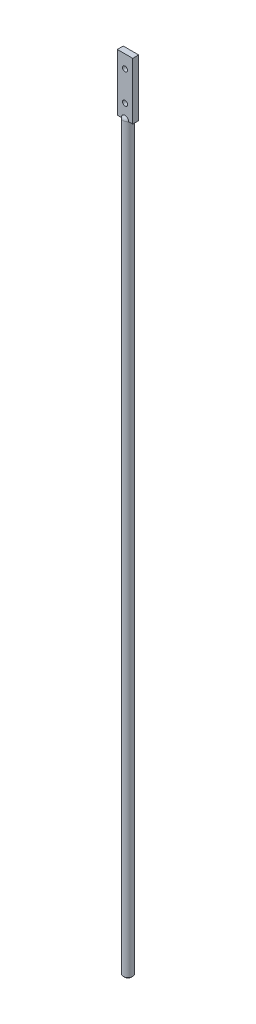
ISO-10303-21;
HEADER;
FILE_DESCRIPTION(('STEP AP214'),'2;1');
FILE_NAME('part.step','',(''),(''),'','','');
FILE_SCHEMA(('AUTOMOTIVE_DESIGN { 1 0 10303 214 1 1 1 1 }'));
ENDSEC;
DATA;
#1=APPLICATION_CONTEXT('core data for automotive mechanical design processes');
#2=APPLICATION_PROTOCOL_DEFINITION('international standard','automotive_design',2000,#1);
#3=PRODUCT_CONTEXT('',#1,'mechanical');
#4=PRODUCT('Part','Part','',(#3));
#5=PRODUCT_RELATED_PRODUCT_CATEGORY('part','',(#4));
#6=PRODUCT_DEFINITION_FORMATION('','',#4);
#7=PRODUCT_DEFINITION_CONTEXT('part definition',#1,'design');
#8=PRODUCT_DEFINITION('design','',#6,#7);
#9=PRODUCT_DEFINITION_SHAPE('','',#8);
#10=(LENGTH_UNIT() NAMED_UNIT(*) SI_UNIT(.MILLI.,.METRE.));
#11=(NAMED_UNIT(*) PLANE_ANGLE_UNIT() SI_UNIT($,.RADIAN.));
#12=(NAMED_UNIT(*) SI_UNIT($,.STERADIAN.) SOLID_ANGLE_UNIT());
#13=UNCERTAINTY_MEASURE_WITH_UNIT(LENGTH_MEASURE(1.E-05),#10,'distance_accuracy_value','');
#14=(GEOMETRIC_REPRESENTATION_CONTEXT(3) GLOBAL_UNCERTAINTY_ASSIGNED_CONTEXT((#13)) GLOBAL_UNIT_ASSIGNED_CONTEXT((#10,
#11,#12)) REPRESENTATION_CONTEXT('',''));
#15=CARTESIAN_POINT('',(0.,0.,0.));
#16=DIRECTION('',(0.,0.,1.));
#17=DIRECTION('',(1.,0.,0.));
#18=AXIS2_PLACEMENT_3D('',#15,#16,#17);
#19=CARTESIAN_POINT('',(0.,13.,-2.5));
#20=DIRECTION('',(0.,0.,-1.));
#21=DIRECTION('',(1.,0.,0.));
#22=AXIS2_PLACEMENT_3D('',#19,#20,#21);
#23=CYLINDRICAL_SURFACE('',#22,2.1);
#24=CARTESIAN_POINT('',(0.,13.,2.5));
#25=DIRECTION('',(0.,0.,1.));
#26=DIRECTION('',(1.,0.,0.));
#27=AXIS2_PLACEMENT_3D('',#24,#25,#26);
#28=CIRCLE('',#27,2.1);
#29=CARTESIAN_POINT('',(2.1,13.,2.5));
#30=VERTEX_POINT('',#29);
#31=EDGE_CURVE('E44',#30,#30,#28,.F.);
#32=ORIENTED_EDGE('',*,*,#31,.F.);
#33=EDGE_LOOP('',(#32));
#34=FACE_BOUND('',#33,.T.);
#35=CARTESIAN_POINT('',(0.,13.,-2.5));
#36=DIRECTION('',(0.,0.,1.));
#37=DIRECTION('',(1.,0.,0.));
#38=AXIS2_PLACEMENT_3D('',#35,#36,#37);
#39=CIRCLE('',#38,2.1);
#40=CARTESIAN_POINT('',(2.1,13.,-2.5));
#41=VERTEX_POINT('',#40);
#42=EDGE_CURVE('E165',#41,#41,#39,.F.);
#43=ORIENTED_EDGE('',*,*,#42,.T.);
#44=EDGE_LOOP('',(#43));
#45=FACE_BOUND('',#44,.T.);
#46=ADVANCED_FACE('F40',(#34,#45),#23,.F.);
#47=CARTESIAN_POINT('',(0.,-12.,-2.5));
#48=DIRECTION('',(0.,0.,-1.));
#49=DIRECTION('',(1.,0.,0.));
#50=AXIS2_PLACEMENT_3D('',#47,#48,#49);
#51=CYLINDRICAL_SURFACE('',#50,2.1);
#52=CARTESIAN_POINT('',(0.,-12.,2.5));
#53=DIRECTION('',(0.,0.,1.));
#54=DIRECTION('',(1.,0.,0.));
#55=AXIS2_PLACEMENT_3D('',#52,#53,#54);
#56=CIRCLE('',#55,2.1);
#57=CARTESIAN_POINT('',(2.1,-12.,2.5));
#58=VERTEX_POINT('',#57);
#59=EDGE_CURVE('E167',#58,#58,#56,.F.);
#60=ORIENTED_EDGE('',*,*,#59,.F.);
#61=EDGE_LOOP('',(#60));
#62=FACE_BOUND('',#61,.T.);
#63=CARTESIAN_POINT('',(0.,-12.,-2.5));
#64=DIRECTION('',(0.,0.,1.));
#65=DIRECTION('',(1.,0.,0.));
#66=AXIS2_PLACEMENT_3D('',#63,#64,#65);
#67=CIRCLE('',#66,2.1);
#68=CARTESIAN_POINT('',(2.1,-12.,-2.5));
#69=VERTEX_POINT('',#68);
#70=EDGE_CURVE('E137',#69,#69,#67,.F.);
#71=ORIENTED_EDGE('',*,*,#70,.T.);
#72=EDGE_LOOP('',(#71));
#73=FACE_BOUND('',#72,.T.);
#74=ADVANCED_FACE('F177',(#62,#73),#51,.F.);
#75=CARTESIAN_POINT('',(-6.50000000000001,24.,-2.5));
#76=DIRECTION('',(0.,1.,0.));
#77=DIRECTION('',(0.,0.,-1.));
#78=AXIS2_PLACEMENT_3D('',#75,#76,#77);
#79=PLANE('',#78);
#80=DIRECTION('',(1.,0.,0.));
#81=VECTOR('',#80,1.);
#82=CARTESIAN_POINT('',(0.,24.,2.5));
#83=LINE('',#82,#81);
#84=CARTESIAN_POINT('',(6.5,24.,2.5));
#85=VERTEX_POINT('',#84);
#86=CARTESIAN_POINT('',(-6.50000000000001,24.,2.5));
#87=VERTEX_POINT('',#86);
#88=EDGE_CURVE('E120',#85,#87,#83,.F.);
#89=ORIENTED_EDGE('',*,*,#88,.F.);
#90=DIRECTION('',(0.,0.,-1.));
#91=VECTOR('',#90,1.);
#92=CARTESIAN_POINT('',(6.5,24.,-2.5));
#93=LINE('',#92,#91);
#94=CARTESIAN_POINT('',(6.5,24.,-2.5));
#95=VERTEX_POINT('',#94);
#96=EDGE_CURVE('E121',#85,#95,#93,.T.);
#97=ORIENTED_EDGE('',*,*,#96,.T.);
#98=DIRECTION('',(1.,0.,0.));
#99=VECTOR('',#98,1.);
#100=CARTESIAN_POINT('',(0.,24.,-2.5));
#101=LINE('',#100,#99);
#102=CARTESIAN_POINT('',(-6.50000000000001,24.,-2.5));
#103=VERTEX_POINT('',#102);
#104=EDGE_CURVE('E105',#95,#103,#101,.F.);
#105=ORIENTED_EDGE('',*,*,#104,.T.);
#106=DIRECTION('',(0.,0.,-1.));
#107=VECTOR('',#106,1.);
#108=CARTESIAN_POINT('',(-6.50000000000001,24.,-2.5));
#109=LINE('',#108,#107);
#110=EDGE_CURVE('E147',#87,#103,#109,.T.);
#111=ORIENTED_EDGE('',*,*,#110,.F.);
#112=EDGE_LOOP('',(#89,#97,#105,#111));
#113=FACE_BOUND('',#112,.T.);
#114=ADVANCED_FACE('F207',(#113),#79,.T.);
#115=CARTESIAN_POINT('',(-6.50000000000001,24.,-2.5));
#116=DIRECTION('',(1.,0.,0.));
#117=DIRECTION('',(0.,1.,0.));
#118=AXIS2_PLACEMENT_3D('',#115,#116,#117);
#119=PLANE('',#118);
#120=DIRECTION('',(0.,1.,0.));
#121=VECTOR('',#120,1.);
#122=CARTESIAN_POINT('',(-6.50000000000001,0.,-2.5));
#123=LINE('',#122,#121);
#124=CARTESIAN_POINT('',(-6.5,-24.,-2.5));
#125=VERTEX_POINT('',#124);
#126=EDGE_CURVE('E132',#103,#125,#123,.F.);
#127=ORIENTED_EDGE('',*,*,#126,.T.);
#128=DIRECTION('',(0.,0.,-1.));
#129=VECTOR('',#128,1.);
#130=CARTESIAN_POINT('',(-6.5,-24.,-2.5));
#131=LINE('',#130,#129);
#132=CARTESIAN_POINT('',(-6.5,-24.,2.5));
#133=VERTEX_POINT('',#132);
#134=EDGE_CURVE('E104',#133,#125,#131,.T.);
#135=ORIENTED_EDGE('',*,*,#134,.F.);
#136=DIRECTION('',(0.,1.,0.));
#137=VECTOR('',#136,1.);
#138=CARTESIAN_POINT('',(-6.50000000000001,0.,2.5));
#139=LINE('',#138,#137);
#140=EDGE_CURVE('E102',#87,#133,#139,.F.);
#141=ORIENTED_EDGE('',*,*,#140,.F.);
#142=ORIENTED_EDGE('',*,*,#110,.T.);
#143=EDGE_LOOP('',(#127,#135,#141,#142));
#144=FACE_BOUND('',#143,.T.);
#145=ADVANCED_FACE('F203',(#144),#119,.F.);
#146=CARTESIAN_POINT('',(0.,-649.5,0.));
#147=DIRECTION('',(0.,-1.,0.));
#148=DIRECTION('',(0.,0.,1.));
#149=AXIS2_PLACEMENT_3D('',#146,#147,#148);
#150=PLANE('',#149);
#151=CARTESIAN_POINT('',(0.,-649.500000000046,0.));
#152=DIRECTION('',(0.,-1.,0.));
#153=DIRECTION('',(0.,0.,-1.));
#154=AXIS2_PLACEMENT_3D('',#151,#152,#153);
#155=CIRCLE('',#154,2.99999999987222);
#156=CARTESIAN_POINT('',(0.,-649.500000000046,-2.99999999987222));
#157=VERTEX_POINT('',#156);
#158=EDGE_CURVE('E97',#157,#157,#155,.T.);
#159=ORIENTED_EDGE('',*,*,#158,.T.);
#160=EDGE_LOOP('',(#159));
#161=FACE_BOUND('',#160,.T.);
#162=ADVANCED_FACE('F199',(#161),#150,.T.);
#163=CARTESIAN_POINT('',(6.5,24.,-2.5));
#164=DIRECTION('',(1.,0.,0.));
#165=DIRECTION('',(0.,1.,0.));
#166=AXIS2_PLACEMENT_3D('',#163,#164,#165);
#167=PLANE('',#166);
#168=DIRECTION('',(0.,1.,0.));
#169=VECTOR('',#168,1.);
#170=CARTESIAN_POINT('',(6.5,0.,2.5));
#171=LINE('',#170,#169);
#172=CARTESIAN_POINT('',(6.5,-24.,2.5));
#173=VERTEX_POINT('',#172);
#174=EDGE_CURVE('E117',#173,#85,#171,.T.);
#175=ORIENTED_EDGE('',*,*,#174,.F.);
#176=DIRECTION('',(0.,0.,-1.));
#177=VECTOR('',#176,1.);
#178=CARTESIAN_POINT('',(6.5,-24.,-2.5));
#179=LINE('',#178,#177);
#180=CARTESIAN_POINT('',(6.5,-24.,-2.5));
#181=VERTEX_POINT('',#180);
#182=EDGE_CURVE('E124',#181,#173,#179,.F.);
#183=ORIENTED_EDGE('',*,*,#182,.F.);
#184=DIRECTION('',(0.,1.,0.));
#185=VECTOR('',#184,1.);
#186=CARTESIAN_POINT('',(6.5,0.,-2.5));
#187=LINE('',#186,#185);
#188=EDGE_CURVE('E109',#181,#95,#187,.T.);
#189=ORIENTED_EDGE('',*,*,#188,.T.);
#190=ORIENTED_EDGE('',*,*,#96,.F.);
#191=EDGE_LOOP('',(#175,#183,#189,#190));
#192=FACE_BOUND('',#191,.T.);
#193=ADVANCED_FACE('F191',(#192),#167,.T.);
#194=CARTESIAN_POINT('',(0.,0.,2.5));
#195=DIRECTION('',(0.,0.,-1.));
#196=DIRECTION('',(1.,0.,0.));
#197=AXIS2_PLACEMENT_3D('',#194,#195,#196);
#198=PLANE('',#197);
#199=ORIENTED_EDGE('',*,*,#59,.T.);
#200=EDGE_LOOP('',(#199));
#201=FACE_BOUND('',#200,.T.);
#202=ORIENTED_EDGE('',*,*,#31,.T.);
#203=EDGE_LOOP('',(#202));
#204=FACE_BOUND('',#203,.T.);
#205=DIRECTION('',(1.,0.,0.));
#206=VECTOR('',#205,1.);
#207=CARTESIAN_POINT('',(-6.5,-24.,2.5));
#208=LINE('',#207,#206);
#209=CARTESIAN_POINT('',(-3.1224989991992,-24.,2.5));
#210=VERTEX_POINT('',#209);
#211=EDGE_CURVE('E84',#210,#133,#208,.F.);
#212=ORIENTED_EDGE('',*,*,#211,.F.);
#213=CARTESIAN_POINT('',(0.,-24.,2.5));
#214=DIRECTION('',(0.,0.,1.));
#215=DIRECTION('',(1.,0.,0.));
#216=AXIS2_PLACEMENT_3D('',#213,#214,#215);
#217=CIRCLE('',#216,3.1224989991992);
#218=CARTESIAN_POINT('',(3.1224989991992,-24.,2.5));
#219=VERTEX_POINT('',#218);
#220=EDGE_CURVE('E92',#210,#219,#217,.F.);
#221=ORIENTED_EDGE('',*,*,#220,.T.);
#222=DIRECTION('',(1.,0.,0.));
#223=VECTOR('',#222,1.);
#224=CARTESIAN_POINT('',(-6.5,-24.,2.5));
#225=LINE('',#224,#223);
#226=EDGE_CURVE('E127',#173,#219,#225,.F.);
#227=ORIENTED_EDGE('',*,*,#226,.F.);
#228=ORIENTED_EDGE('',*,*,#174,.T.);
#229=ORIENTED_EDGE('',*,*,#88,.T.);
#230=ORIENTED_EDGE('',*,*,#140,.T.);
#231=EDGE_LOOP('',(#212,#221,#227,#228,#229,#230));
#232=FACE_BOUND('',#231,.T.);
#233=ADVANCED_FACE('F99',(#201,#204,#232),#198,.F.);
#234=CARTESIAN_POINT('',(0.,0.,-2.5));
#235=DIRECTION('',(0.,0.,-1.));
#236=DIRECTION('',(1.,0.,0.));
#237=AXIS2_PLACEMENT_3D('',#234,#235,#236);
#238=PLANE('',#237);
#239=ORIENTED_EDGE('',*,*,#188,.F.);
#240=DIRECTION('',(1.,0.,0.));
#241=VECTOR('',#240,1.);
#242=CARTESIAN_POINT('',(-6.5,-24.,-2.5));
#243=LINE('',#242,#241);
#244=CARTESIAN_POINT('',(3.1224989991992,-24.,-2.5));
#245=VERTEX_POINT('',#244);
#246=EDGE_CURVE('E96',#245,#181,#243,.T.);
#247=ORIENTED_EDGE('',*,*,#246,.F.);
#248=CARTESIAN_POINT('',(0.,-24.,-2.5));
#249=DIRECTION('',(0.,0.,1.));
#250=DIRECTION('',(1.,0.,0.));
#251=AXIS2_PLACEMENT_3D('',#248,#249,#250);
#252=CIRCLE('',#251,3.1224989991992);
#253=CARTESIAN_POINT('',(-3.1224989991992,-24.,-2.5));
#254=VERTEX_POINT('',#253);
#255=EDGE_CURVE('E89',#245,#254,#252,.T.);
#256=ORIENTED_EDGE('',*,*,#255,.T.);
#257=DIRECTION('',(1.,0.,0.));
#258=VECTOR('',#257,1.);
#259=CARTESIAN_POINT('',(-6.5,-24.,-2.5));
#260=LINE('',#259,#258);
#261=EDGE_CURVE('E87',#125,#254,#260,.T.);
#262=ORIENTED_EDGE('',*,*,#261,.F.);
#263=ORIENTED_EDGE('',*,*,#126,.F.);
#264=ORIENTED_EDGE('',*,*,#104,.F.);
#265=EDGE_LOOP('',(#239,#247,#256,#262,#263,#264));
#266=FACE_BOUND('',#265,.T.);
#267=ORIENTED_EDGE('',*,*,#70,.F.);
#268=EDGE_LOOP('',(#267));
#269=FACE_BOUND('',#268,.T.);
#270=ORIENTED_EDGE('',*,*,#42,.F.);
#271=EDGE_LOOP('',(#270));
#272=FACE_BOUND('',#271,.T.);
#273=ADVANCED_FACE('F181',(#266,#269,#272),#238,.T.);
#274=CARTESIAN_POINT('',(-6.5,-24.,-2.5));
#275=DIRECTION('',(0.,1.,0.));
#276=DIRECTION('',(0.,0.,-1.));
#277=AXIS2_PLACEMENT_3D('',#274,#275,#276);
#278=PLANE('',#277);
#279=ORIENTED_EDGE('',*,*,#261,.T.);
#280=CARTESIAN_POINT('',(0.,-24.,0.));
#281=DIRECTION('',(0.,-1.,0.));
#282=DIRECTION('',(0.,0.,-1.));
#283=AXIS2_PLACEMENT_3D('',#280,#281,#282);
#284=CIRCLE('',#283,4.);
#285=EDGE_CURVE('E71',#254,#210,#284,.F.);
#286=ORIENTED_EDGE('',*,*,#285,.T.);
#287=ORIENTED_EDGE('',*,*,#211,.T.);
#288=ORIENTED_EDGE('',*,*,#134,.T.);
#289=EDGE_LOOP('',(#279,#286,#287,#288));
#290=FACE_BOUND('',#289,.T.);
#291=ADVANCED_FACE('F80',(#290),#278,.F.);
#292=CARTESIAN_POINT('',(0.,-648.50000000007,0.));
#293=DIRECTION('',(0.,1.,0.));
#294=DIRECTION('',(0.,0.,-1.));
#295=AXIS2_PLACEMENT_3D('',#292,#293,#294);
#296=CONICAL_SURFACE('',#295,3.99999999984857,0.785398163397448);
#297=CARTESIAN_POINT('',(0.,-648.5,0.));
#298=DIRECTION('',(0.,-1.,0.));
#299=DIRECTION('',(0.,0.,-1.));
#300=AXIS2_PLACEMENT_3D('',#297,#298,#299);
#301=CIRCLE('',#300,4.);
#302=CARTESIAN_POINT('',(0.,-648.5,-4.));
#303=VERTEX_POINT('',#302);
#304=EDGE_CURVE('E76',#303,#303,#301,.T.);
#305=ORIENTED_EDGE('',*,*,#304,.T.);
#306=EDGE_LOOP('',(#305));
#307=FACE_BOUND('',#306,.T.);
#308=ORIENTED_EDGE('',*,*,#158,.F.);
#309=EDGE_LOOP('',(#308));
#310=FACE_BOUND('',#309,.T.);
#311=ADVANCED_FACE('F189',(#307,#310),#296,.T.);
#312=CARTESIAN_POINT('',(0.,-24.,0.));
#313=DIRECTION('',(1.,0.,0.));
#314=DIRECTION('',(0.,0.,1.));
#315=AXIS2_PLACEMENT_3D('',#312,#313,#314);
#316=SPHERICAL_SURFACE('',#315,4.);
#317=ORIENTED_EDGE('',*,*,#220,.F.);
#318=CARTESIAN_POINT('',(0.,-24.,0.));
#319=DIRECTION('',(0.,-1.,0.));
#320=DIRECTION('',(0.,0.,-1.));
#321=AXIS2_PLACEMENT_3D('',#318,#319,#320);
#322=CIRCLE('',#321,4.);
#323=EDGE_CURVE('E67',#210,#219,#322,.F.);
#324=ORIENTED_EDGE('',*,*,#323,.T.);
#325=EDGE_LOOP('',(#317,#324));
#326=FACE_BOUND('',#325,.T.);
#327=ADVANCED_FACE('F93',(#326),#316,.T.);
#328=CARTESIAN_POINT('',(-6.5,-24.,-2.5));
#329=DIRECTION('',(0.,1.,0.));
#330=DIRECTION('',(0.,0.,-1.));
#331=AXIS2_PLACEMENT_3D('',#328,#329,#330);
#332=PLANE('',#331);
#333=ORIENTED_EDGE('',*,*,#226,.T.);
#334=CARTESIAN_POINT('',(0.,-24.,0.));
#335=DIRECTION('',(0.,-1.,0.));
#336=DIRECTION('',(0.,0.,-1.));
#337=AXIS2_PLACEMENT_3D('',#334,#335,#336);
#338=CIRCLE('',#337,4.);
#339=EDGE_CURVE('E50',#219,#245,#338,.F.);
#340=ORIENTED_EDGE('',*,*,#339,.T.);
#341=ORIENTED_EDGE('',*,*,#246,.T.);
#342=ORIENTED_EDGE('',*,*,#182,.T.);
#343=EDGE_LOOP('',(#333,#340,#341,#342));
#344=FACE_BOUND('',#343,.T.);
#345=ADVANCED_FACE('F215',(#344),#332,.F.);
#346=CARTESIAN_POINT('',(0.,-24.,0.));
#347=DIRECTION('',(1.,0.,0.));
#348=DIRECTION('',(0.,0.785891834052638,-0.618363990841463));
#349=AXIS2_PLACEMENT_3D('',#346,#347,#348);
#350=SPHERICAL_SURFACE('',#349,4.);
#351=ORIENTED_EDGE('',*,*,#255,.F.);
#352=CARTESIAN_POINT('',(0.,-24.,0.));
#353=DIRECTION('',(0.,-1.,0.));
#354=DIRECTION('',(0.,0.,-1.));
#355=AXIS2_PLACEMENT_3D('',#352,#353,#354);
#356=CIRCLE('',#355,4.);
#357=EDGE_CURVE('E11',#245,#254,#356,.F.);
#358=ORIENTED_EDGE('',*,*,#357,.T.);
#359=EDGE_LOOP('',(#351,#358));
#360=FACE_BOUND('',#359,.T.);
#361=ADVANCED_FACE('F42',(#360),#350,.T.);
#362=CARTESIAN_POINT('',(0.,-649.5,0.));
#363=DIRECTION('',(0.,1.,0.));
#364=DIRECTION('',(0.,0.,-1.));
#365=AXIS2_PLACEMENT_3D('',#362,#363,#364);
#366=CYLINDRICAL_SURFACE('',#365,4.);
#367=ORIENTED_EDGE('',*,*,#285,.F.);
#368=ORIENTED_EDGE('',*,*,#357,.F.);
#369=ORIENTED_EDGE('',*,*,#339,.F.);
#370=ORIENTED_EDGE('',*,*,#323,.F.);
#371=EDGE_LOOP('',(#367,#368,#369,#370));
#372=FACE_BOUND('',#371,.T.);
#373=ORIENTED_EDGE('',*,*,#304,.F.);
#374=EDGE_LOOP('',(#373));
#375=FACE_BOUND('',#374,.T.);
#376=ADVANCED_FACE('F69',(#372,#375),#366,.T.);
#377=CLOSED_SHELL('',(#46,#74,#114,#145,#162,#193,#233,#273,#291,#311,#327,#345,#361,#376));
#378=MANIFOLD_SOLID_BREP('B2',#377);
#379=ADVANCED_BREP_SHAPE_REPRESENTATION('',(#18,#378),#14);
#380=SHAPE_DEFINITION_REPRESENTATION(#9,#379);
ENDSEC;
END-ISO-10303-21;
